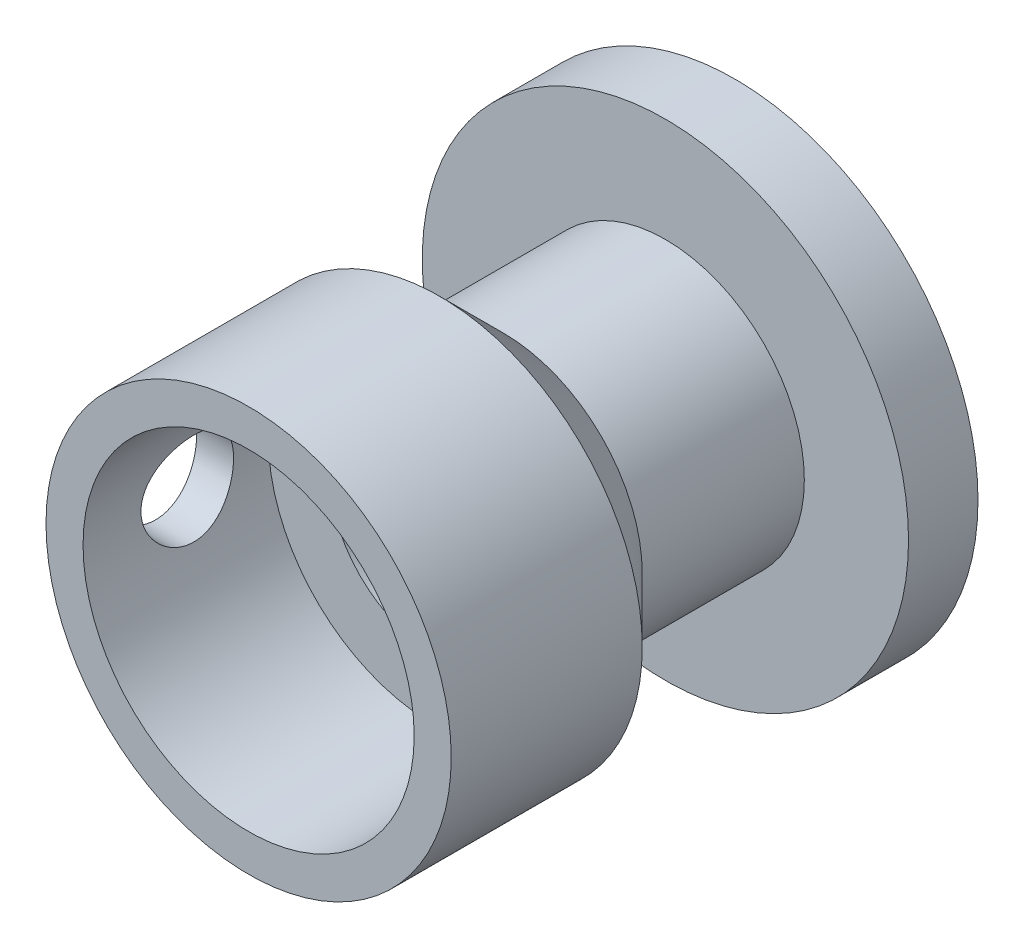
ISO-10303-21;
HEADER;
FILE_DESCRIPTION(('STEP AP214'),'2;1');
FILE_NAME('part.step','',(''),(''),'','','');
FILE_SCHEMA(('AUTOMOTIVE_DESIGN { 1 0 10303 214 1 1 1 1 }'));
ENDSEC;
DATA;
#1=APPLICATION_CONTEXT('core data for automotive mechanical design processes');
#2=APPLICATION_PROTOCOL_DEFINITION('international standard','automotive_design',2000,#1);
#3=PRODUCT_CONTEXT('',#1,'mechanical');
#4=PRODUCT('Part','Part','',(#3));
#5=PRODUCT_RELATED_PRODUCT_CATEGORY('part','',(#4));
#6=PRODUCT_DEFINITION_FORMATION('','',#4);
#7=PRODUCT_DEFINITION_CONTEXT('part definition',#1,'design');
#8=PRODUCT_DEFINITION('design','',#6,#7);
#9=PRODUCT_DEFINITION_SHAPE('','',#8);
#10=(LENGTH_UNIT() NAMED_UNIT(*) SI_UNIT(.MILLI.,.METRE.));
#11=(NAMED_UNIT(*) PLANE_ANGLE_UNIT() SI_UNIT($,.RADIAN.));
#12=(NAMED_UNIT(*) SI_UNIT($,.STERADIAN.) SOLID_ANGLE_UNIT());
#13=UNCERTAINTY_MEASURE_WITH_UNIT(LENGTH_MEASURE(1.E-05),#10,'distance_accuracy_value','');
#14=(GEOMETRIC_REPRESENTATION_CONTEXT(3) GLOBAL_UNCERTAINTY_ASSIGNED_CONTEXT((#13)) GLOBAL_UNIT_ASSIGNED_CONTEXT((#10,
#11,#12)) REPRESENTATION_CONTEXT('',''));
#15=CARTESIAN_POINT('',(0.,0.,0.));
#16=DIRECTION('',(0.,0.,1.));
#17=DIRECTION('',(1.,0.,0.));
#18=AXIS2_PLACEMENT_3D('',#15,#16,#17);
#19=CARTESIAN_POINT('',(0.,0.,9.));
#20=DIRECTION('',(0.,0.,1.));
#21=DIRECTION('',(1.,0.,0.));
#22=AXIS2_PLACEMENT_3D('',#19,#20,#21);
#23=PLANE('',#22);
#24=CARTESIAN_POINT('',(0.,0.,9.));
#25=DIRECTION('',(0.,0.,1.));
#26=DIRECTION('',(1.,0.,0.));
#27=AXIS2_PLACEMENT_3D('',#24,#25,#26);
#28=CIRCLE('',#27,1.5);
#29=CARTESIAN_POINT('',(1.5,0.,9.));
#30=VERTEX_POINT('',#29);
#31=EDGE_CURVE('E74',#30,#30,#28,.T.);
#32=ORIENTED_EDGE('',*,*,#31,.F.);
#33=EDGE_LOOP('',(#32));
#34=FACE_BOUND('',#33,.T.);
#35=CARTESIAN_POINT('',(0.,0.,9.));
#36=DIRECTION('',(0.,0.,1.));
#37=DIRECTION('',(1.,0.,0.));
#38=AXIS2_PLACEMENT_3D('',#35,#36,#37);
#39=CIRCLE('',#38,4.5);
#40=CARTESIAN_POINT('',(4.5,0.,9.));
#41=VERTEX_POINT('',#40);
#42=EDGE_CURVE('E56',#41,#41,#39,.T.);
#43=ORIENTED_EDGE('',*,*,#42,.T.);
#44=EDGE_LOOP('',(#43));
#45=FACE_BOUND('',#44,.T.);
#46=ADVANCED_FACE('F33',(#34,#45),#23,.T.);
#47=CARTESIAN_POINT('',(0.,0.,9.));
#48=DIRECTION('',(0.,0.,1.));
#49=DIRECTION('',(1.,0.,0.));
#50=AXIS2_PLACEMENT_3D('',#47,#48,#49);
#51=CYLINDRICAL_SURFACE('',#50,4.5);
#52=ORIENTED_EDGE('',*,*,#42,.F.);
#53=EDGE_LOOP('',(#52));
#54=FACE_BOUND('',#53,.T.);
#55=CARTESIAN_POINT('',(0.,0.,13.));
#56=DIRECTION('',(0.,0.,1.));
#57=DIRECTION('',(1.,0.,0.));
#58=AXIS2_PLACEMENT_3D('',#55,#56,#57);
#59=CIRCLE('',#58,4.5);
#60=CARTESIAN_POINT('',(4.5,0.,13.));
#61=VERTEX_POINT('',#60);
#62=EDGE_CURVE('E62',#61,#61,#59,.F.);
#63=ORIENTED_EDGE('',*,*,#62,.F.);
#64=EDGE_LOOP('',(#63));
#65=FACE_BOUND('',#64,.T.);
#66=ADVANCED_FACE('F104',(#54,#65),#51,.F.);
#67=CARTESIAN_POINT('',(0.,0.,13.));
#68=DIRECTION('',(0.,0.,1.));
#69=DIRECTION('',(1.,0.,0.));
#70=AXIS2_PLACEMENT_3D('',#67,#68,#69);
#71=PLANE('',#70);
#72=CARTESIAN_POINT('',(0.,0.,13.));
#73=DIRECTION('',(0.,0.,1.));
#74=DIRECTION('',(1.,0.,0.));
#75=AXIS2_PLACEMENT_3D('',#72,#73,#74);
#76=CIRCLE('',#75,7.15);
#77=CARTESIAN_POINT('',(7.15,0.,13.));
#78=VERTEX_POINT('',#77);
#79=EDGE_CURVE('E65',#78,#78,#76,.T.);
#80=ORIENTED_EDGE('',*,*,#79,.T.);
#81=EDGE_LOOP('',(#80));
#82=FACE_BOUND('',#81,.T.);
#83=ORIENTED_EDGE('',*,*,#62,.T.);
#84=EDGE_LOOP('',(#83));
#85=FACE_BOUND('',#84,.T.);
#86=ADVANCED_FACE('F102',(#82,#85),#71,.T.);
#87=CARTESIAN_POINT('',(0.,0.,13.));
#88=DIRECTION('',(0.,0.,1.));
#89=DIRECTION('',(1.,0.,0.));
#90=AXIS2_PLACEMENT_3D('',#87,#88,#89);
#91=CYLINDRICAL_SURFACE('',#90,7.15);
#92=CARTESIAN_POINT('',(-7.15,0.,14.5));
#93=CARTESIAN_POINT('',(-7.14999856626091,-0.110051188004979,14.5000021683749));
#94=CARTESIAN_POINT('',(-7.14743443621754,-0.220124936197297,14.509113789322));
#95=CARTESIAN_POINT('',(-7.13745515890771,-0.437088325154985,14.5452467521326));
#96=CARTESIAN_POINT('',(-7.13003801635923,-0.543976637343512,14.5722754605409));
#97=CARTESIAN_POINT('',(-7.11116913740349,-0.751407013241678,14.6432851864654));
#98=CARTESIAN_POINT('',(-7.09972289307424,-0.851957497172608,14.6872431353311));
#99=CARTESIAN_POINT('',(-7.07399784561319,-1.04425990197884,14.7907745285187));
#100=CARTESIAN_POINT('',(-7.05971878004051,-1.13601100648464,14.8503494198046));
#101=CARTESIAN_POINT('',(-7.02945879446167,-1.3104312366422,14.985013716742));
#102=CARTESIAN_POINT('',(-7.01344653611472,-1.39284611590496,15.0604253833536));
#103=CARTESIAN_POINT('',(-6.98172053173826,-1.54403977702727,15.223934498259));
#104=CARTESIAN_POINT('',(-6.96600682865211,-1.61281661045436,15.312033756097));
#105=CARTESIAN_POINT('',(-6.93633249202209,-1.73605832768149,15.5004925758656));
#106=CARTESIAN_POINT('',(-6.92241118019471,-1.79022400295039,15.6010545688496));
#107=CARTESIAN_POINT('',(-6.89836154554086,-1.88077603495565,15.8103111987039));
#108=CARTESIAN_POINT('',(-6.88823244473581,-1.91716603886876,15.9190041619959));
#109=CARTESIAN_POINT('',(-6.87323879157233,-1.97023791620819,16.1386060652363));
#110=CARTESIAN_POINT('',(-6.86825054468198,-1.98738377720665,16.2493942129202));
#111=CARTESIAN_POINT('',(-6.86373440363572,-2.00292816258147,16.4723781367366));
#112=CARTESIAN_POINT('',(-6.86420537718826,-2.00133057451733,16.5845736161536));
#113=CARTESIAN_POINT('',(-6.87044415958717,-1.97980027493799,16.803509830727));
#114=CARTESIAN_POINT('',(-6.87604764884781,-1.96043632834641,16.9103119370667));
#115=CARTESIAN_POINT('',(-6.89165595401354,-1.90483695156788,17.1190871459502));
#116=CARTESIAN_POINT('',(-6.90166115299597,-1.86860005292508,17.2210598273372));
#117=CARTESIAN_POINT('',(-6.92508490755723,-1.77983706558872,17.4187293005269));
#118=CARTESIAN_POINT('',(-6.93854368865594,-1.7271172935403,17.5143341504014));
#119=CARTESIAN_POINT('',(-6.96733739352034,-1.6070199752306,17.6955365868269));
#120=CARTESIAN_POINT('',(-6.98267271928761,-1.53963928582969,17.7811320214099));
#121=CARTESIAN_POINT('',(-7.01416898887531,-1.38925618419119,17.9431268585416));
#122=CARTESIAN_POINT('',(-7.03033976716952,-1.30577820658174,18.0190835463883));
#123=CARTESIAN_POINT('',(-7.0611914300345,-1.12706961407906,18.1560151105862));
#124=CARTESIAN_POINT('',(-7.07587224361443,-1.03183843967181,18.2169892732768));
#125=CARTESIAN_POINT('',(-7.10219571832662,-0.831596291337182,18.3224473063766));
#126=CARTESIAN_POINT('',(-7.11382227038239,-0.726537275282431,18.3668442416107));
#127=CARTESIAN_POINT('',(-7.13261107104565,-0.510045540225612,18.4372145045138));
#128=CARTESIAN_POINT('',(-7.13977439648338,-0.398614365705378,18.4631922763318));
#129=CARTESIAN_POINT('',(-7.14866393279395,-0.176314058284732,18.4952758803705));
#130=CARTESIAN_POINT('',(-7.15055456853066,-0.0655381303881079,18.5019828662164));
#131=CARTESIAN_POINT('',(-7.14916208576435,0.155558171334417,18.4970040546027));
#132=CARTESIAN_POINT('',(-7.14587956013166,0.265878595910557,18.4853203648072));
#133=CARTESIAN_POINT('',(-7.13461638915483,0.480739992223641,18.4443825488047));
#134=CARTESIAN_POINT('',(-7.12672707569853,0.585351234645625,18.415469775466));
#135=CARTESIAN_POINT('',(-7.10715122268555,0.788223878190099,18.3412963085857));
#136=CARTESIAN_POINT('',(-7.0954642521681,0.886484557128256,18.2960337595951));
#137=CARTESIAN_POINT('',(-7.06921175127245,1.07615602271628,18.1893711116188));
#138=CARTESIAN_POINT('',(-7.05459090661969,1.16737954374187,18.127651974731));
#139=CARTESIAN_POINT('',(-7.02415727326854,1.33838375199866,17.9902239541525));
#140=CARTESIAN_POINT('',(-7.00834422527452,1.41816193893636,17.914512021903));
#141=CARTESIAN_POINT('',(-6.97669319624158,1.56658836991948,17.7484331789552));
#142=CARTESIAN_POINT('',(-6.96086988087053,1.63481085478552,17.6576822129381));
#143=CARTESIAN_POINT('',(-6.93152620685511,1.7550757134281,17.4656804632991));
#144=CARTESIAN_POINT('',(-6.91800576190459,1.80711869363462,17.3644300733996));
#145=CARTESIAN_POINT('',(-6.89495642406558,1.89316177746907,17.1547555236003));
#146=CARTESIAN_POINT('',(-6.88540565984477,1.92726102834849,17.0463745879646));
#147=CARTESIAN_POINT('',(-6.87139148956402,1.97665139159816,16.8250999222502));
#148=CARTESIAN_POINT('',(-6.86692662128235,1.99194790995262,16.7122074989146));
#149=CARTESIAN_POINT('',(-6.86372042516239,2.00296535418008,16.4894967188785));
#150=CARTESIAN_POINT('',(-6.86477799084023,1.99937406856356,16.3797147982772));
#151=CARTESIAN_POINT('',(-6.87202183096324,1.97433084110715,16.1623886075773));
#152=CARTESIAN_POINT('',(-6.87820794735042,1.95287944970198,16.0548442686228));
#153=CARTESIAN_POINT('',(-6.89488619952882,1.89314160199496,15.8460092319573));
#154=CARTESIAN_POINT('',(-6.90533747423047,1.85501465888055,15.7446694079039));
#155=CARTESIAN_POINT('',(-6.92936597435589,1.76313134371544,15.5497457933912));
#156=CARTESIAN_POINT('',(-6.94294373343773,1.70937230301759,15.4561633307452));
#157=CARTESIAN_POINT('',(-6.97224004019594,1.58572463944196,15.2761620813938));
#158=CARTESIAN_POINT('',(-6.9880133492895,1.51537332348256,15.1900700171777));
#159=CARTESIAN_POINT('',(-7.0196336477387,1.3614001471508,15.0306900867051));
#160=CARTESIAN_POINT('',(-7.03548065445077,1.27777498918864,14.9574054116886));
#161=CARTESIAN_POINT('',(-7.06592292805345,1.09718211726544,14.8239635316907));
#162=CARTESIAN_POINT('',(-7.08047851758167,0.999940006403322,14.7641677938932));
#163=CARTESIAN_POINT('',(-7.10624927083632,0.796376975618465,14.6618644787391));
#164=CARTESIAN_POINT('',(-7.11746636282582,0.690061342260199,14.619346916577));
#165=CARTESIAN_POINT('',(-7.13402134082867,0.486941440822818,14.5577059947792));
#166=CARTESIAN_POINT('',(-7.13996751762888,0.390927431471526,14.5361195583747));
#167=CARTESIAN_POINT('',(-7.1479572501656,0.196614763564283,14.5072664637795));
#168=CARTESIAN_POINT('',(-7.1500012808589,0.0983163845289178,14.4999980628397));
#169=CARTESIAN_POINT('',(-7.15,0.,14.5));
#170=B_SPLINE_CURVE_WITH_KNOTS('',3,(#92,#93,#94,#95,#96,#97,#98,#99,#100,#101,#102,#103,#104,
#105,#106,#107,#108,#109,#110,#111,#112,#113,#114,#115,#116,#117,#118,#119,#120,#121,#122,#123,
#124,#125,#126,#127,#128,#129,#130,#131,#132,#133,#134,#135,#136,#137,#138,#139,#140,#141,#142,
#143,#144,#145,#146,#147,#148,#149,#150,#151,#152,#153,#154,#155,#156,#157,#158,#159,#160,#161,
#162,#163,#164,#165,#166,#167,#168,#169),.UNSPECIFIED.,.T.,.F.,(4,2,2,2,2,2,2,2,2,2,2,2,2,2,2,2,
2,2,2,2,2,2,2,2,2,2,2,2,2,2,2,2,2,2,2,2,2,2,4),(0.,0.329792793141753,0.65972126354921,
0.989201738195492,1.31871275114694,1.65572372958868,1.99278282128538,2.33629485782082,
2.67973638360735,3.01470644795778,3.34960703774023,3.67414676871417,3.99871474971607,
4.32724980799759,4.65585537010915,4.99630625834691,5.33677336009469,5.67900168282618,
6.02114740507859,6.3524974489205,6.68380952114081,7.00876603875238,7.33375944554233,
7.66558022814525,7.99747338872601,8.33973903593403,8.68199185301001,9.02233316610806,
9.36257660457886,9.6905180196614,10.0184493282162,10.3433101032608,10.6682263697877,
11.0035808385807,11.3390187494741,11.6825916342792,12.0259656900208,12.3206284095759,
12.6152552614362),.UNSPECIFIED.);
#171=CARTESIAN_POINT('',(-7.15,0.,14.5));
#172=VERTEX_POINT('',#171);
#173=EDGE_CURVE('E77',#172,#172,#170,.T.);
#174=ORIENTED_EDGE('',*,*,#173,.T.);
#175=EDGE_LOOP('',(#174));
#176=FACE_BOUND('',#175,.T.);
#177=ORIENTED_EDGE('',*,*,#79,.F.);
#178=EDGE_LOOP('',(#177));
#179=FACE_BOUND('',#178,.T.);
#180=CARTESIAN_POINT('',(0.,0.,21.));
#181=DIRECTION('',(0.,0.,1.));
#182=DIRECTION('',(1.,0.,0.));
#183=AXIS2_PLACEMENT_3D('',#180,#181,#182);
#184=CIRCLE('',#183,7.15);
#185=CARTESIAN_POINT('',(7.15,0.,21.));
#186=VERTEX_POINT('',#185);
#187=EDGE_CURVE('E66',#186,#186,#184,.T.);
#188=ORIENTED_EDGE('',*,*,#187,.T.);
#189=EDGE_LOOP('',(#188));
#190=FACE_BOUND('',#189,.T.);
#191=ADVANCED_FACE('F88',(#176,#179,#190),#91,.F.);
#192=CARTESIAN_POINT('',(0.,0.,3.));
#193=DIRECTION('',(0.,0.,1.));
#194=DIRECTION('',(1.,0.,0.));
#195=AXIS2_PLACEMENT_3D('',#192,#193,#194);
#196=PLANE('',#195);
#197=CARTESIAN_POINT('',(0.,0.,3.));
#198=DIRECTION('',(0.,0.,1.));
#199=DIRECTION('',(1.,0.,0.));
#200=AXIS2_PLACEMENT_3D('',#197,#198,#199);
#201=CIRCLE('',#200,10.5);
#202=CARTESIAN_POINT('',(10.5,0.,3.));
#203=VERTEX_POINT('',#202);
#204=EDGE_CURVE('E44',#203,#203,#201,.T.);
#205=ORIENTED_EDGE('',*,*,#204,.T.);
#206=EDGE_LOOP('',(#205));
#207=FACE_BOUND('',#206,.T.);
#208=CARTESIAN_POINT('',(0.,0.,3.));
#209=DIRECTION('',(0.,0.,1.));
#210=DIRECTION('',(1.,0.,0.));
#211=AXIS2_PLACEMENT_3D('',#208,#209,#210);
#212=CIRCLE('',#211,6.);
#213=CARTESIAN_POINT('',(6.,0.,3.));
#214=VERTEX_POINT('',#213);
#215=EDGE_CURVE('E52',#214,#214,#212,.T.);
#216=ORIENTED_EDGE('',*,*,#215,.F.);
#217=EDGE_LOOP('',(#216));
#218=FACE_BOUND('',#217,.T.);
#219=ADVANCED_FACE('F111',(#207,#218),#196,.T.);
#220=CARTESIAN_POINT('',(0.,0.,3.));
#221=DIRECTION('',(0.,0.,-1.));
#222=DIRECTION('',(-1.,0.,0.));
#223=AXIS2_PLACEMENT_3D('',#220,#221,#222);
#224=CYLINDRICAL_SURFACE('',#223,10.5);
#225=ORIENTED_EDGE('',*,*,#204,.F.);
#226=EDGE_LOOP('',(#225));
#227=FACE_BOUND('',#226,.T.);
#228=CARTESIAN_POINT('',(0.,0.,0.));
#229=DIRECTION('',(0.,0.,1.));
#230=DIRECTION('',(1.,0.,0.));
#231=AXIS2_PLACEMENT_3D('',#228,#229,#230);
#232=CIRCLE('',#231,10.5);
#233=CARTESIAN_POINT('',(10.5,0.,0.));
#234=VERTEX_POINT('',#233);
#235=EDGE_CURVE('E48',#234,#234,#232,.T.);
#236=ORIENTED_EDGE('',*,*,#235,.T.);
#237=EDGE_LOOP('',(#236));
#238=FACE_BOUND('',#237,.T.);
#239=ADVANCED_FACE('F132',(#227,#238),#224,.T.);
#240=CARTESIAN_POINT('',(0.,0.,0.));
#241=DIRECTION('',(0.,0.,1.));
#242=DIRECTION('',(1.,0.,0.));
#243=AXIS2_PLACEMENT_3D('',#240,#241,#242);
#244=PLANE('',#243);
#245=CARTESIAN_POINT('',(0.,0.,0.));
#246=DIRECTION('',(0.,0.,1.));
#247=DIRECTION('',(1.,0.,0.));
#248=AXIS2_PLACEMENT_3D('',#245,#246,#247);
#249=CIRCLE('',#248,1.5);
#250=CARTESIAN_POINT('',(1.5,0.,0.));
#251=VERTEX_POINT('',#250);
#252=EDGE_CURVE('E69',#251,#251,#249,.F.);
#253=ORIENTED_EDGE('',*,*,#252,.F.);
#254=EDGE_LOOP('',(#253));
#255=FACE_BOUND('',#254,.T.);
#256=ORIENTED_EDGE('',*,*,#235,.F.);
#257=EDGE_LOOP('',(#256));
#258=FACE_BOUND('',#257,.T.);
#259=ADVANCED_FACE('F129',(#255,#258),#244,.F.);
#260=CARTESIAN_POINT('',(0.,0.,13.));
#261=DIRECTION('',(0.,0.,-1.));
#262=DIRECTION('',(-1.,0.,0.));
#263=AXIS2_PLACEMENT_3D('',#260,#261,#262);
#264=CYLINDRICAL_SURFACE('',#263,6.);
#265=CARTESIAN_POINT('',(0.,0.,9.99999999999998));
#266=DIRECTION('',(0.,0.,1.));
#267=DIRECTION('',(1.,0.,0.));
#268=AXIS2_PLACEMENT_3D('',#265,#266,#267);
#269=CIRCLE('',#268,6.);
#270=CARTESIAN_POINT('',(6.,0.,9.99999999999998));
#271=VERTEX_POINT('',#270);
#272=EDGE_CURVE('E40',#271,#271,#269,.F.);
#273=ORIENTED_EDGE('',*,*,#272,.T.);
#274=EDGE_LOOP('',(#273));
#275=FACE_BOUND('',#274,.T.);
#276=ORIENTED_EDGE('',*,*,#215,.T.);
#277=EDGE_LOOP('',(#276));
#278=FACE_BOUND('',#277,.T.);
#279=ADVANCED_FACE('F126',(#275,#278),#264,.T.);
#280=CARTESIAN_POINT('',(0.,0.,21.));
#281=DIRECTION('',(0.,0.,-1.));
#282=DIRECTION('',(-1.,0.,0.));
#283=AXIS2_PLACEMENT_3D('',#280,#281,#282);
#284=CYLINDRICAL_SURFACE('',#283,8.75);
#285=CARTESIAN_POINT('',(-8.75,0.,14.5));
#286=CARTESIAN_POINT('',(-8.74999798403401,-0.110797467641392,14.5000035992037));
#287=CARTESIAN_POINT('',(-8.74787426792563,-0.221637378479564,14.5092381173579));
#288=CARTESIAN_POINT('',(-8.73960765256352,-0.440160260645337,14.5458887663873));
#289=CARTESIAN_POINT('',(-8.73346206074067,-0.547841066516225,14.5733170778274));
#290=CARTESIAN_POINT('',(-8.71783483861599,-0.756856803303785,14.6454445687474));
#291=CARTESIAN_POINT('',(-8.70835685325836,-0.858198525771152,14.6901248833531));
#292=CARTESIAN_POINT('',(-8.68708367861657,-1.05194510817363,14.795426184359));
#293=CARTESIAN_POINT('',(-8.6752885067451,-1.14435003525719,14.8560470509737));
#294=CARTESIAN_POINT('',(-8.65043976491944,-1.31921284380598,14.9926261049202));
#295=CARTESIAN_POINT('',(-8.63736940910119,-1.40149269853396,15.0688091843247));
#296=CARTESIAN_POINT('',(-8.61155960188236,-1.55222495575719,15.2338676946836));
#297=CARTESIAN_POINT('',(-8.59882018230991,-1.62067603251486,15.3227443411524));
#298=CARTESIAN_POINT('',(-8.5749480986638,-1.7426086602488,15.5120032810679));
#299=CARTESIAN_POINT('',(-8.56383688728399,-1.7958977927077,15.6125124916299));
#300=CARTESIAN_POINT('',(-8.54472144233678,-1.88475865669925,15.8213559358024));
#301=CARTESIAN_POINT('',(-8.53671680029431,-1.92033271771674,15.9296891384324));
#302=CARTESIAN_POINT('',(-8.52489227385479,-1.97215951306484,16.1491659509232));
#303=CARTESIAN_POINT('',(-8.52100387809606,-1.98872896544198,16.2602309995297));
#304=CARTESIAN_POINT('',(-8.51764655638893,-2.00306153817964,16.4836272894633));
#305=CARTESIAN_POINT('',(-8.51817703514422,-2.00082719172597,16.5959583582003));
#306=CARTESIAN_POINT('',(-8.52353562985453,-1.97786980705357,16.8163219594319));
#307=CARTESIAN_POINT('',(-8.52827756816924,-1.95751749105999,16.9243955296502));
#308=CARTESIAN_POINT('',(-8.54138821006848,-1.8994904479953,17.1355524682918));
#309=CARTESIAN_POINT('',(-8.54975713382707,-1.86181466930495,17.238635533347));
#310=CARTESIAN_POINT('',(-8.56926193289891,-1.76987724439003,17.4379129323403));
#311=CARTESIAN_POINT('',(-8.58042102861084,-1.71547548139628,17.5340402552172));
#312=CARTESIAN_POINT('',(-8.60423493168343,-1.59172870462855,17.7159376275739));
#313=CARTESIAN_POINT('',(-8.61688996045725,-1.52238147752176,17.8017061400378));
#314=CARTESIAN_POINT('',(-8.64263752527252,-1.36876252532966,17.9625827439223));
#315=CARTESIAN_POINT('',(-8.65573332503362,-1.28417625671285,18.0373902805868));
#316=CARTESIAN_POINT('',(-8.68061476724555,-1.1035077310898,18.171809802673));
#317=CARTESIAN_POINT('',(-8.69240038152673,-1.00742522700097,18.2314214614115));
#318=CARTESIAN_POINT('',(-8.71337750142071,-0.806106214040116,18.3338420320226));
#319=CARTESIAN_POINT('',(-8.72256247378175,-0.700847504640297,18.3766087299836));
#320=CARTESIAN_POINT('',(-8.73725525366348,-0.484380292611526,18.4437623344745));
#321=CARTESIAN_POINT('',(-8.74276364631752,-0.373172739794719,18.4681521657909));
#322=CARTESIAN_POINT('',(-8.74939833356695,-0.150540119696463,18.4974159894534));
#323=CARTESIAN_POINT('',(-8.7506167116947,-0.0391716359777113,18.5027001455371));
#324=CARTESIAN_POINT('',(-8.74879340725784,0.182857018013344,18.4947183353386));
#325=CARTESIAN_POINT('',(-8.74575204174862,0.293517240386154,18.4814537496511));
#326=CARTESIAN_POINT('',(-8.73580937302033,0.509609141351123,18.4370905899159));
#327=CARTESIAN_POINT('',(-8.72895522155222,0.615087884349859,18.4062097548186));
#328=CARTESIAN_POINT('',(-8.71215539529353,0.819366874320131,18.3277344796168));
#329=CARTESIAN_POINT('',(-8.70220944106296,0.918166516645305,18.2801385287342));
#330=CARTESIAN_POINT('',(-8.68010385006686,1.1079596090638,18.1687476324619));
#331=CARTESIAN_POINT('',(-8.66791255784382,1.1988098472004,18.1047151010556));
#332=CARTESIAN_POINT('',(-8.64272842827592,1.3686224607752,17.9625787135165));
#333=CARTESIAN_POINT('',(-8.62973547673384,1.4475831369953,17.8844728495653));
#334=CARTESIAN_POINT('',(-8.6040902131529,1.59301791769619,17.7145173683212));
#335=CARTESIAN_POINT('',(-8.59145012752951,1.65920678045592,17.6224214616771));
#336=CARTESIAN_POINT('',(-8.56824022421961,1.775182108422,17.4281816106278));
#337=CARTESIAN_POINT('',(-8.55767031480589,1.82496930043483,17.3260381117218));
#338=CARTESIAN_POINT('',(-8.53990401178755,1.90637791843995,17.1151587523888));
#339=CARTESIAN_POINT('',(-8.53268815290462,1.9381044077648,17.0064651732946));
#340=CARTESIAN_POINT('',(-8.52241600386035,1.9827911846099,16.7851014729574));
#341=CARTESIAN_POINT('',(-8.51935897721024,1.99575479487958,16.6724320594226));
#342=CARTESIAN_POINT('',(-8.51780002775368,2.0023964245858,16.4491984885449));
#343=CARTESIAN_POINT('',(-8.51919104574016,1.99652770403295,16.3386483276876));
#344=CARTESIAN_POINT('',(-8.5261276991631,1.96669181064342,16.1201575495528));
#345=CARTESIAN_POINT('',(-8.5316732759895,1.94272489312539,16.0122168954841));
#346=CARTESIAN_POINT('',(-8.54623968631577,1.87760087333832,15.8024092300742));
#347=CARTESIAN_POINT('',(-8.55524600646941,1.8365155009943,15.7005188787077));
#348=CARTESIAN_POINT('',(-8.57572358289991,1.73838043292354,15.5050121016461));
#349=CARTESIAN_POINT('',(-8.5871951226817,1.6813289008299,15.4113966293267));
#350=CARTESIAN_POINT('',(-8.61162602277799,1.55140256712376,15.2328756668907));
#351=CARTESIAN_POINT('',(-8.62461256398907,1.47820725203166,15.1482071202363));
#352=CARTESIAN_POINT('',(-8.65043404659231,1.31871330392506,14.9922063004871));
#353=CARTESIAN_POINT('',(-8.66326895202616,1.2324116275705,14.9208771334462));
#354=CARTESIAN_POINT('',(-8.68756156917111,1.04765015456509,14.7925865607895));
#355=CARTESIAN_POINT('',(-8.69899669105796,0.949032641040302,14.7358477515133));
#356=CARTESIAN_POINT('',(-8.7189716042072,0.74341544770961,14.6398427287931));
#357=CARTESIAN_POINT('',(-8.72751371799773,0.636422577070974,14.6005624915275));
#358=CARTESIAN_POINT('',(-8.73929351226494,0.441171611569102,14.5472430555698));
#359=CARTESIAN_POINT('',(-8.74328278089225,0.353935004208255,14.5295620165832));
#360=CARTESIAN_POINT('',(-8.74863676482031,0.177807984983747,14.5059393526257));
#361=CARTESIAN_POINT('',(-8.7500016178617,0.0889176601615588,14.4999971115515));
#362=CARTESIAN_POINT('',(-8.75,0.,14.5));
#363=B_SPLINE_CURVE_WITH_KNOTS('',3,(#285,#286,#287,#288,#289,#290,#291,#292,#293,#294,#295,
#296,#297,#298,#299,#300,#301,#302,#303,#304,#305,#306,#307,#308,#309,#310,#311,#312,#313,#314,
#315,#316,#317,#318,#319,#320,#321,#322,#323,#324,#325,#326,#327,#328,#329,#330,#331,#332,#333,
#334,#335,#336,#337,#338,#339,#340,#341,#342,#343,#344,#345,#346,#347,#348,#349,#350,#351,#352,
#353,#354,#355,#356,#357,#358,#359,#360,#361,#362),.UNSPECIFIED.,.T.,.F.,(4,2,2,2,2,2,2,2,2,2,2,
2,2,2,2,2,2,2,2,2,2,2,2,2,2,2,2,2,2,2,2,2,2,2,2,2,2,2,4),(0.,0.332066818475209,
0.664356177092314,0.99628320531963,1.32820773935135,1.6653197412289,2.00246404604652,
2.3437134474544,2.68491796361531,3.02034957114242,3.35573599115223,3.68441369615285,
4.01311135613861,4.3446412775613,4.67622033033866,5.01565166931443,5.35509030482184,
5.69537425118619,6.0356040279111,6.36848482422126,6.70134084532106,7.03016920546846,
7.35902729407256,7.69293661513046,8.02689361223733,8.36761344785935,8.70831818314735,
9.04702015616859,9.38566214055255,9.71621531054079,10.0467638173678,10.3759409682167,
10.7051559953392,11.0416141114233,11.3781504739792,11.7195515993372,12.0606779920518,
12.3271836708532,12.5936753619059),.UNSPECIFIED.);
#364=CARTESIAN_POINT('',(-8.75,0.,14.5));
#365=VERTEX_POINT('',#364);
#366=EDGE_CURVE('E84',#365,#365,#363,.T.);
#367=ORIENTED_EDGE('',*,*,#366,.F.);
#368=EDGE_LOOP('',(#367));
#369=FACE_BOUND('',#368,.T.);
#370=CARTESIAN_POINT('',(0.,0.,12.75));
#371=DIRECTION('',(0.,0.,1.));
#372=DIRECTION('',(1.,0.,0.));
#373=AXIS2_PLACEMENT_3D('',#370,#371,#372);
#374=CIRCLE('',#373,8.75);
#375=CARTESIAN_POINT('',(8.75,0.,12.75));
#376=VERTEX_POINT('',#375);
#377=EDGE_CURVE('E10',#376,#376,#374,.T.);
#378=ORIENTED_EDGE('',*,*,#377,.T.);
#379=EDGE_LOOP('',(#378));
#380=FACE_BOUND('',#379,.T.);
#381=CARTESIAN_POINT('',(0.,0.,21.));
#382=DIRECTION('',(0.,0.,1.));
#383=DIRECTION('',(1.,0.,0.));
#384=AXIS2_PLACEMENT_3D('',#381,#382,#383);
#385=CIRCLE('',#384,8.75);
#386=CARTESIAN_POINT('',(8.75,0.,21.));
#387=VERTEX_POINT('',#386);
#388=EDGE_CURVE('E59',#387,#387,#385,.T.);
#389=ORIENTED_EDGE('',*,*,#388,.F.);
#390=EDGE_LOOP('',(#389));
#391=FACE_BOUND('',#390,.T.);
#392=ADVANCED_FACE('F124',(#369,#380,#391),#284,.T.);
#393=CARTESIAN_POINT('',(0.,0.,21.));
#394=DIRECTION('',(0.,0.,1.));
#395=DIRECTION('',(1.,0.,0.));
#396=AXIS2_PLACEMENT_3D('',#393,#394,#395);
#397=PLANE('',#396);
#398=ORIENTED_EDGE('',*,*,#187,.F.);
#399=EDGE_LOOP('',(#398));
#400=FACE_BOUND('',#399,.T.);
#401=ORIENTED_EDGE('',*,*,#388,.T.);
#402=EDGE_LOOP('',(#401));
#403=FACE_BOUND('',#402,.T.);
#404=ADVANCED_FACE('F167',(#400,#403),#397,.T.);
#405=CARTESIAN_POINT('',(0.,0.,13.));
#406=DIRECTION('',(0.,0.,1.));
#407=DIRECTION('',(1.,0.,0.));
#408=AXIS2_PLACEMENT_3D('',#405,#406,#407);
#409=CONICAL_SURFACE('',#408,9.00000000000005,0.785398163397453);
#410=ORIENTED_EDGE('',*,*,#272,.F.);
#411=EDGE_LOOP('',(#410));
#412=FACE_BOUND('',#411,.T.);
#413=ORIENTED_EDGE('',*,*,#377,.F.);
#414=EDGE_LOOP('',(#413));
#415=FACE_BOUND('',#414,.T.);
#416=ADVANCED_FACE('F35',(#412,#415),#409,.T.);
#417=CARTESIAN_POINT('',(0.,0.,-4.24264068711928));
#418=DIRECTION('',(0.,0.,1.));
#419=DIRECTION('',(1.,0.,0.));
#420=AXIS2_PLACEMENT_3D('',#417,#418,#419);
#421=CYLINDRICAL_SURFACE('',#420,1.5);
#422=ORIENTED_EDGE('',*,*,#252,.T.);
#423=EDGE_LOOP('',(#422));
#424=FACE_BOUND('',#423,.T.);
#425=ORIENTED_EDGE('',*,*,#31,.T.);
#426=EDGE_LOOP('',(#425));
#427=FACE_BOUND('',#426,.T.);
#428=ADVANCED_FACE('F95',(#424,#427),#421,.F.);
#429=CARTESIAN_POINT('',(-10.501,0.,16.5));
#430=DIRECTION('',(1.,0.,0.));
#431=DIRECTION('',(0.,0.,-1.));
#432=AXIS2_PLACEMENT_3D('',#429,#430,#431);
#433=CYLINDRICAL_SURFACE('',#432,2.);
#434=ORIENTED_EDGE('',*,*,#366,.T.);
#435=EDGE_LOOP('',(#434));
#436=FACE_BOUND('',#435,.T.);
#437=ORIENTED_EDGE('',*,*,#173,.F.);
#438=EDGE_LOOP('',(#437));
#439=FACE_BOUND('',#438,.T.);
#440=ADVANCED_FACE('F92',(#436,#439),#433,.F.);
#441=CLOSED_SHELL('',(#46,#66,#86,#191,#219,#239,#259,#279,#392,#404,#416,#428,#440));
#442=MANIFOLD_SOLID_BREP('B2',#441);
#443=ADVANCED_BREP_SHAPE_REPRESENTATION('',(#18,#442),#14);
#444=SHAPE_DEFINITION_REPRESENTATION(#9,#443);
ENDSEC;
END-ISO-10303-21;
